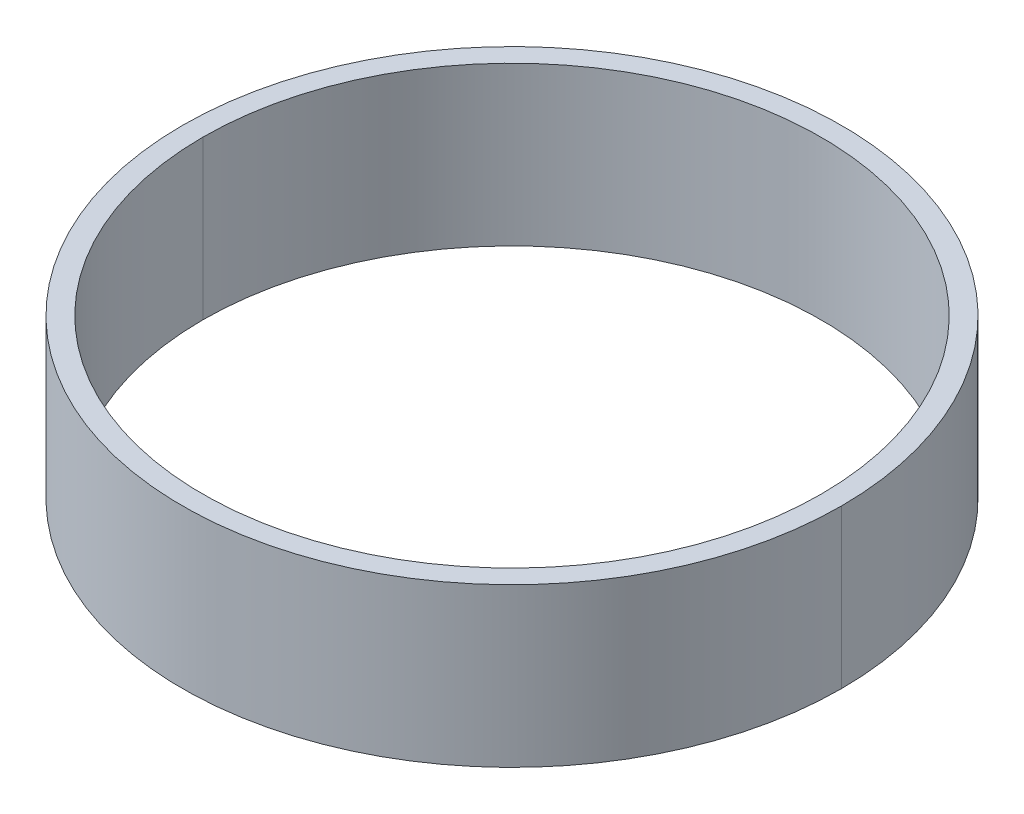
ISO-10303-21;
HEADER;
FILE_DESCRIPTION(('STEP AP214'),'2;1');
FILE_NAME('part.step','',(''),(''),'','','');
FILE_SCHEMA(('AUTOMOTIVE_DESIGN { 1 0 10303 214 1 1 1 1 }'));
ENDSEC;
DATA;
#1=APPLICATION_CONTEXT('core data for automotive mechanical design processes');
#2=APPLICATION_PROTOCOL_DEFINITION('international standard','automotive_design',2000,#1);
#3=PRODUCT_CONTEXT('',#1,'mechanical');
#4=PRODUCT('Part','Part','',(#3));
#5=PRODUCT_RELATED_PRODUCT_CATEGORY('part','',(#4));
#6=PRODUCT_DEFINITION_FORMATION('','',#4);
#7=PRODUCT_DEFINITION_CONTEXT('part definition',#1,'design');
#8=PRODUCT_DEFINITION('design','',#6,#7);
#9=PRODUCT_DEFINITION_SHAPE('','',#8);
#10=(LENGTH_UNIT() NAMED_UNIT(*) SI_UNIT(.MILLI.,.METRE.));
#11=(NAMED_UNIT(*) PLANE_ANGLE_UNIT() SI_UNIT($,.RADIAN.));
#12=(NAMED_UNIT(*) SI_UNIT($,.STERADIAN.) SOLID_ANGLE_UNIT());
#13=UNCERTAINTY_MEASURE_WITH_UNIT(LENGTH_MEASURE(1.E-05),#10,'distance_accuracy_value','');
#14=(GEOMETRIC_REPRESENTATION_CONTEXT(3) GLOBAL_UNCERTAINTY_ASSIGNED_CONTEXT((#13)) GLOBAL_UNIT_ASSIGNED_CONTEXT((#10,
#11,#12)) REPRESENTATION_CONTEXT('',''));
#15=CARTESIAN_POINT('',(0.,0.,0.));
#16=DIRECTION('',(0.,0.,1.));
#17=DIRECTION('',(1.,0.,0.));
#18=AXIS2_PLACEMENT_3D('',#15,#16,#17);
#19=CARTESIAN_POINT('',(0.,0.,0.));
#20=DIRECTION('',(0.,1.,0.));
#21=DIRECTION('',(1.,0.,0.));
#22=AXIS2_PLACEMENT_3D('',#19,#20,#21);
#23=CYLINDRICAL_SURFACE('',#22,54.15);
#24=DIRECTION('',(0.,-1.,0.));
#25=VECTOR('',#24,1.);
#26=CARTESIAN_POINT('',(54.15,26.,0.));
#27=LINE('',#26,#25);
#28=CARTESIAN_POINT('',(54.15,26.,0.));
#29=VERTEX_POINT('',#28);
#30=CARTESIAN_POINT('',(54.15,0.,0.));
#31=VERTEX_POINT('',#30);
#32=EDGE_CURVE('E11',#29,#31,#27,.T.);
#33=ORIENTED_EDGE('',*,*,#32,.F.);
#34=CARTESIAN_POINT('',(0.,26.,0.));
#35=DIRECTION('',(0.,-1.,0.));
#36=DIRECTION('',(1.,0.,0.));
#37=AXIS2_PLACEMENT_3D('',#34,#35,#36);
#38=CIRCLE('',#37,54.15);
#39=CARTESIAN_POINT('',(-54.15,26.,0.));
#40=VERTEX_POINT('',#39);
#41=EDGE_CURVE('E20',#29,#40,#38,.T.);
#42=ORIENTED_EDGE('',*,*,#41,.T.);
#43=DIRECTION('',(0.,-1.,0.));
#44=VECTOR('',#43,1.);
#45=CARTESIAN_POINT('',(-54.15,26.,0.));
#46=LINE('',#45,#44);
#47=CARTESIAN_POINT('',(-54.15,0.,0.));
#48=VERTEX_POINT('',#47);
#49=EDGE_CURVE('E26',#40,#48,#46,.T.);
#50=ORIENTED_EDGE('',*,*,#49,.T.);
#51=CARTESIAN_POINT('',(0.,0.,0.));
#52=DIRECTION('',(0.,1.,0.));
#53=DIRECTION('',(-1.,0.,0.));
#54=AXIS2_PLACEMENT_3D('',#51,#52,#53);
#55=CIRCLE('',#54,54.15);
#56=EDGE_CURVE('E77',#48,#31,#55,.T.);
#57=ORIENTED_EDGE('',*,*,#56,.T.);
#58=EDGE_LOOP('',(#33,#42,#50,#57));
#59=FACE_BOUND('',#58,.T.);
#60=ADVANCED_FACE('F17',(#59),#23,.T.);
#61=CARTESIAN_POINT('',(0.,0.,0.));
#62=DIRECTION('',(0.,1.,0.));
#63=DIRECTION('',(1.,0.,0.));
#64=AXIS2_PLACEMENT_3D('',#61,#62,#63);
#65=CYLINDRICAL_SURFACE('',#64,54.15);
#66=ORIENTED_EDGE('',*,*,#49,.F.);
#67=CARTESIAN_POINT('',(0.,26.,0.));
#68=DIRECTION('',(0.,-1.,0.));
#69=DIRECTION('',(-1.,0.,0.));
#70=AXIS2_PLACEMENT_3D('',#67,#68,#69);
#71=CIRCLE('',#70,54.15);
#72=EDGE_CURVE('E94',#40,#29,#71,.T.);
#73=ORIENTED_EDGE('',*,*,#72,.T.);
#74=ORIENTED_EDGE('',*,*,#32,.T.);
#75=CARTESIAN_POINT('',(0.,0.,0.));
#76=DIRECTION('',(0.,1.,0.));
#77=DIRECTION('',(1.,0.,0.));
#78=AXIS2_PLACEMENT_3D('',#75,#76,#77);
#79=CIRCLE('',#78,54.15);
#80=EDGE_CURVE('E82',#31,#48,#79,.T.);
#81=ORIENTED_EDGE('',*,*,#80,.T.);
#82=EDGE_LOOP('',(#66,#73,#74,#81));
#83=FACE_BOUND('',#82,.T.);
#84=ADVANCED_FACE('F83',(#83),#65,.T.);
#85=CARTESIAN_POINT('',(0.,26.,0.));
#86=DIRECTION('',(0.,1.,0.));
#87=DIRECTION('',(1.,0.,0.));
#88=AXIS2_PLACEMENT_3D('',#85,#86,#87);
#89=CYLINDRICAL_SURFACE('',#88,50.8);
#90=DIRECTION('',(0.,-1.,0.));
#91=VECTOR('',#90,1.);
#92=CARTESIAN_POINT('',(-50.8,26.,0.));
#93=LINE('',#92,#91);
#94=CARTESIAN_POINT('',(-50.8,26.,0.));
#95=VERTEX_POINT('',#94);
#96=CARTESIAN_POINT('',(-50.8,0.,0.));
#97=VERTEX_POINT('',#96);
#98=EDGE_CURVE('E67',#95,#97,#93,.T.);
#99=ORIENTED_EDGE('',*,*,#98,.T.);
#100=CARTESIAN_POINT('',(0.,0.,0.));
#101=DIRECTION('',(0.,-1.,0.));
#102=DIRECTION('',(-1.,0.,0.));
#103=AXIS2_PLACEMENT_3D('',#100,#101,#102);
#104=CIRCLE('',#103,50.8);
#105=CARTESIAN_POINT('',(50.8,0.,0.));
#106=VERTEX_POINT('',#105);
#107=EDGE_CURVE('E86',#97,#106,#104,.T.);
#108=ORIENTED_EDGE('',*,*,#107,.T.);
#109=DIRECTION('',(0.,-1.,0.));
#110=VECTOR('',#109,1.);
#111=CARTESIAN_POINT('',(50.8,26.,0.));
#112=LINE('',#111,#110);
#113=CARTESIAN_POINT('',(50.8,26.,0.));
#114=VERTEX_POINT('',#113);
#115=EDGE_CURVE('E97',#114,#106,#112,.T.);
#116=ORIENTED_EDGE('',*,*,#115,.F.);
#117=CARTESIAN_POINT('',(0.,26.,0.));
#118=DIRECTION('',(0.,-1.,0.));
#119=DIRECTION('',(-1.,0.,0.));
#120=AXIS2_PLACEMENT_3D('',#117,#118,#119);
#121=CIRCLE('',#120,50.8);
#122=EDGE_CURVE('E80',#95,#114,#121,.T.);
#123=ORIENTED_EDGE('',*,*,#122,.F.);
#124=EDGE_LOOP('',(#99,#108,#116,#123));
#125=FACE_BOUND('',#124,.T.);
#126=ADVANCED_FACE('F128',(#125),#89,.F.);
#127=CARTESIAN_POINT('',(0.,26.,0.));
#128=DIRECTION('',(0.,1.,0.));
#129=DIRECTION('',(1.,0.,0.));
#130=AXIS2_PLACEMENT_3D('',#127,#128,#129);
#131=PLANE('',#130);
#132=ORIENTED_EDGE('',*,*,#122,.T.);
#133=CARTESIAN_POINT('',(0.,26.,0.));
#134=DIRECTION('',(0.,-1.,0.));
#135=DIRECTION('',(1.,0.,0.));
#136=AXIS2_PLACEMENT_3D('',#133,#134,#135);
#137=CIRCLE('',#136,50.8);
#138=EDGE_CURVE('E102',#114,#95,#137,.T.);
#139=ORIENTED_EDGE('',*,*,#138,.T.);
#140=EDGE_LOOP('',(#132,#139));
#141=FACE_BOUND('',#140,.T.);
#142=ORIENTED_EDGE('',*,*,#41,.F.);
#143=ORIENTED_EDGE('',*,*,#72,.F.);
#144=EDGE_LOOP('',(#142,#143));
#145=FACE_BOUND('',#144,.T.);
#146=ADVANCED_FACE('F124',(#141,#145),#131,.T.);
#147=CARTESIAN_POINT('',(0.,26.,0.));
#148=DIRECTION('',(0.,1.,0.));
#149=DIRECTION('',(1.,0.,0.));
#150=AXIS2_PLACEMENT_3D('',#147,#148,#149);
#151=CYLINDRICAL_SURFACE('',#150,50.8);
#152=ORIENTED_EDGE('',*,*,#115,.T.);
#153=CARTESIAN_POINT('',(0.,0.,0.));
#154=DIRECTION('',(0.,-1.,0.));
#155=DIRECTION('',(1.,0.,0.));
#156=AXIS2_PLACEMENT_3D('',#153,#154,#155);
#157=CIRCLE('',#156,50.8);
#158=EDGE_CURVE('E100',#106,#97,#157,.T.);
#159=ORIENTED_EDGE('',*,*,#158,.T.);
#160=ORIENTED_EDGE('',*,*,#98,.F.);
#161=ORIENTED_EDGE('',*,*,#138,.F.);
#162=EDGE_LOOP('',(#152,#159,#160,#161));
#163=FACE_BOUND('',#162,.T.);
#164=ADVANCED_FACE('F117',(#163),#151,.F.);
#165=CARTESIAN_POINT('',(0.,0.,0.));
#166=DIRECTION('',(0.,1.,0.));
#167=DIRECTION('',(1.,0.,0.));
#168=AXIS2_PLACEMENT_3D('',#165,#166,#167);
#169=PLANE('',#168);
#170=ORIENTED_EDGE('',*,*,#107,.F.);
#171=ORIENTED_EDGE('',*,*,#158,.F.);
#172=EDGE_LOOP('',(#170,#171));
#173=FACE_BOUND('',#172,.T.);
#174=ORIENTED_EDGE('',*,*,#56,.F.);
#175=ORIENTED_EDGE('',*,*,#80,.F.);
#176=EDGE_LOOP('',(#174,#175));
#177=FACE_BOUND('',#176,.T.);
#178=ADVANCED_FACE('F88',(#173,#177),#169,.F.);
#179=CLOSED_SHELL('',(#60,#84,#126,#146,#164,#178));
#180=MANIFOLD_SOLID_BREP('B1',#179);
#181=ADVANCED_BREP_SHAPE_REPRESENTATION('',(#18,#180),#14);
#182=SHAPE_DEFINITION_REPRESENTATION(#9,#181);
ENDSEC;
END-ISO-10303-21;
